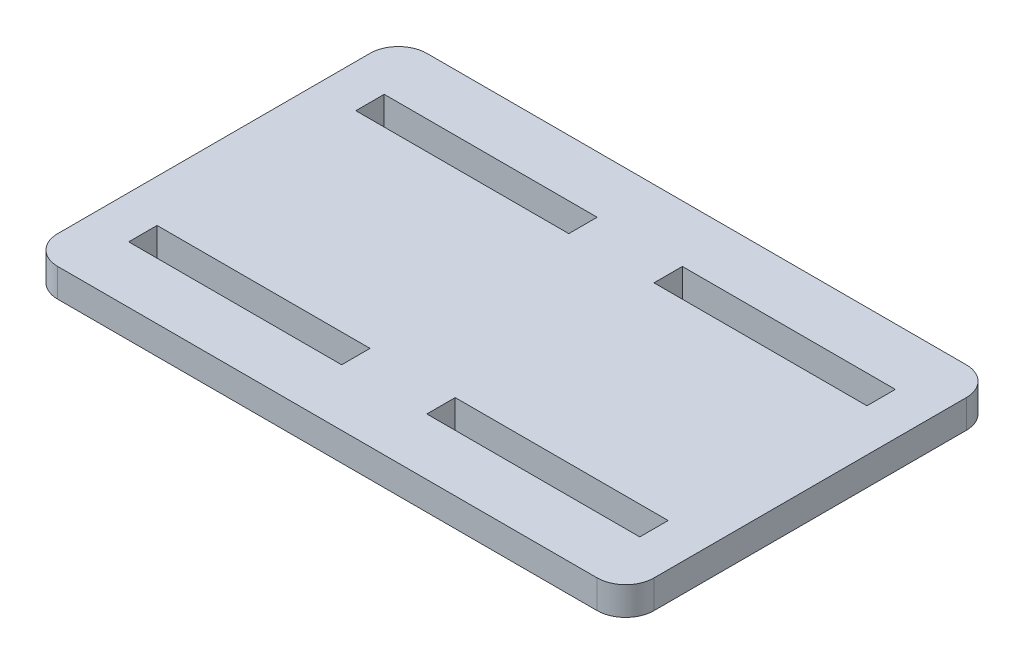
ISO-10303-21;
HEADER;
FILE_DESCRIPTION(('STEP AP214'),'2;1');
FILE_NAME('part.step','',(''),(''),'','','');
FILE_SCHEMA(('AUTOMOTIVE_DESIGN { 1 0 10303 214 1 1 1 1 }'));
ENDSEC;
DATA;
#1=APPLICATION_CONTEXT('core data for automotive mechanical design processes');
#2=APPLICATION_PROTOCOL_DEFINITION('international standard','automotive_design',2000,#1);
#3=PRODUCT_CONTEXT('',#1,'mechanical');
#4=PRODUCT('Part','Part','',(#3));
#5=PRODUCT_RELATED_PRODUCT_CATEGORY('part','',(#4));
#6=PRODUCT_DEFINITION_FORMATION('','',#4);
#7=PRODUCT_DEFINITION_CONTEXT('part definition',#1,'design');
#8=PRODUCT_DEFINITION('design','',#6,#7);
#9=PRODUCT_DEFINITION_SHAPE('','',#8);
#10=(LENGTH_UNIT() NAMED_UNIT(*) SI_UNIT(.MILLI.,.METRE.));
#11=(NAMED_UNIT(*) PLANE_ANGLE_UNIT() SI_UNIT($,.RADIAN.));
#12=(NAMED_UNIT(*) SI_UNIT($,.STERADIAN.) SOLID_ANGLE_UNIT());
#13=UNCERTAINTY_MEASURE_WITH_UNIT(LENGTH_MEASURE(1.E-05),#10,'distance_accuracy_value','');
#14=(GEOMETRIC_REPRESENTATION_CONTEXT(3) GLOBAL_UNCERTAINTY_ASSIGNED_CONTEXT((#13)) GLOBAL_UNIT_ASSIGNED_CONTEXT((#10,
#11,#12)) REPRESENTATION_CONTEXT('',''));
#15=CARTESIAN_POINT('',(0.,0.,0.));
#16=DIRECTION('',(0.,0.,1.));
#17=DIRECTION('',(1.,0.,0.));
#18=AXIS2_PLACEMENT_3D('',#15,#16,#17);
#19=CARTESIAN_POINT('',(-5.07999999999999,-5.08,8.89));
#20=DIRECTION('',(1.,0.,0.));
#21=DIRECTION('',(0.,0.,-1.));
#22=AXIS2_PLACEMENT_3D('',#19,#20,#21);
#23=PLANE('',#22);
#24=DIRECTION('',(0.,0.,-1.));
#25=VECTOR('',#24,1.);
#26=CARTESIAN_POINT('',(-5.07999999999999,-2.54,-8.89));
#27=LINE('',#26,#25);
#28=CARTESIAN_POINT('',(-5.07999999999999,-2.54,8.89));
#29=VERTEX_POINT('',#28);
#30=CARTESIAN_POINT('',(-5.07999999999999,-2.54,-8.89));
#31=VERTEX_POINT('',#30);
#32=EDGE_CURVE('E348',#29,#31,#27,.T.);
#33=ORIENTED_EDGE('',*,*,#32,.F.);
#34=DIRECTION('',(0.,1.,0.));
#35=VECTOR('',#34,1.);
#36=CARTESIAN_POINT('',(-5.07999999999999,-5.08,8.89));
#37=LINE('',#36,#35);
#38=CARTESIAN_POINT('',(-5.07999999999999,0.,8.89));
#39=VERTEX_POINT('',#38);
#40=EDGE_CURVE('E383',#29,#39,#37,.T.);
#41=ORIENTED_EDGE('',*,*,#40,.T.);
#42=DIRECTION('',(0.,0.,-1.));
#43=VECTOR('',#42,1.);
#44=CARTESIAN_POINT('',(-5.07999999999999,0.,8.89));
#45=LINE('',#44,#43);
#46=CARTESIAN_POINT('',(-5.07999999999999,0.,-8.89));
#47=VERTEX_POINT('',#46);
#48=EDGE_CURVE('E372',#39,#47,#45,.T.);
#49=ORIENTED_EDGE('',*,*,#48,.T.);
#50=DIRECTION('',(0.,1.,0.));
#51=VECTOR('',#50,1.);
#52=CARTESIAN_POINT('',(-5.07999999999999,-5.08,-8.89));
#53=LINE('',#52,#51);
#54=EDGE_CURVE('E400',#31,#47,#53,.T.);
#55=ORIENTED_EDGE('',*,*,#54,.F.);
#56=EDGE_LOOP('',(#33,#41,#49,#55));
#57=FACE_BOUND('',#56,.T.);
#58=ADVANCED_FACE('F41',(#57),#23,.F.);
#59=CARTESIAN_POINT('',(11.43,0.,0.));
#60=DIRECTION('',(0.,1.,0.));
#61=DIRECTION('',(0.,0.,1.));
#62=AXIS2_PLACEMENT_3D('',#59,#60,#61);
#63=PLANE('',#62);
#64=DIRECTION('',(1.,0.,0.));
#65=VECTOR('',#64,1.);
#66=CARTESIAN_POINT('',(0.,0.,16.51));
#67=LINE('',#66,#65);
#68=CARTESIAN_POINT('',(-39.37,0.,16.51));
#69=VERTEX_POINT('',#68);
#70=CARTESIAN_POINT('',(8.89,0.,16.51));
#71=VERTEX_POINT('',#70);
#72=EDGE_CURVE('E542',#69,#71,#67,.T.);
#73=ORIENTED_EDGE('',*,*,#72,.F.);
#74=CARTESIAN_POINT('',(-39.37,0.,13.97));
#75=DIRECTION('',(0.,1.,0.));
#76=DIRECTION('',(0.,0.,1.));
#77=AXIS2_PLACEMENT_3D('',#74,#75,#76);
#78=CIRCLE('',#77,2.54);
#79=CARTESIAN_POINT('',(-41.91,0.,13.97));
#80=VERTEX_POINT('',#79);
#81=EDGE_CURVE('E613',#69,#80,#78,.F.);
#82=ORIENTED_EDGE('',*,*,#81,.T.);
#83=DIRECTION('',(0.,0.,-1.));
#84=VECTOR('',#83,1.);
#85=CARTESIAN_POINT('',(-41.91,0.,0.));
#86=LINE('',#85,#84);
#87=CARTESIAN_POINT('',(-41.91,0.,-13.97));
#88=VERTEX_POINT('',#87);
#89=EDGE_CURVE('E559',#80,#88,#86,.T.);
#90=ORIENTED_EDGE('',*,*,#89,.T.);
#91=CARTESIAN_POINT('',(-39.37,0.,-13.97));
#92=DIRECTION('',(0.,1.,0.));
#93=DIRECTION('',(0.,0.,1.));
#94=AXIS2_PLACEMENT_3D('',#91,#92,#93);
#95=CIRCLE('',#94,2.54);
#96=CARTESIAN_POINT('',(-39.37,0.,-16.51));
#97=VERTEX_POINT('',#96);
#98=EDGE_CURVE('E604',#88,#97,#95,.F.);
#99=ORIENTED_EDGE('',*,*,#98,.T.);
#100=DIRECTION('',(1.,0.,0.));
#101=VECTOR('',#100,1.);
#102=CARTESIAN_POINT('',(0.,0.,-16.51));
#103=LINE('',#102,#101);
#104=CARTESIAN_POINT('',(8.89,0.,-16.51));
#105=VERTEX_POINT('',#104);
#106=EDGE_CURVE('E466',#97,#105,#103,.T.);
#107=ORIENTED_EDGE('',*,*,#106,.T.);
#108=CARTESIAN_POINT('',(8.89,0.,-13.97));
#109=DIRECTION('',(0.,1.,0.));
#110=DIRECTION('',(0.,0.,1.));
#111=AXIS2_PLACEMENT_3D('',#108,#109,#110);
#112=CIRCLE('',#111,2.54);
#113=CARTESIAN_POINT('',(11.43,0.,-13.97));
#114=VERTEX_POINT('',#113);
#115=EDGE_CURVE('E607',#105,#114,#112,.F.);
#116=ORIENTED_EDGE('',*,*,#115,.T.);
#117=DIRECTION('',(0.,0.,-1.));
#118=VECTOR('',#117,1.);
#119=CARTESIAN_POINT('',(11.43,0.,0.));
#120=LINE('',#119,#118);
#121=CARTESIAN_POINT('',(11.43,0.,13.97));
#122=VERTEX_POINT('',#121);
#123=EDGE_CURVE('E567',#122,#114,#120,.T.);
#124=ORIENTED_EDGE('',*,*,#123,.F.);
#125=CARTESIAN_POINT('',(8.89,0.,13.97));
#126=DIRECTION('',(0.,1.,0.));
#127=DIRECTION('',(0.,0.,1.));
#128=AXIS2_PLACEMENT_3D('',#125,#126,#127);
#129=CIRCLE('',#128,2.54);
#130=EDGE_CURVE('E610',#122,#71,#129,.F.);
#131=ORIENTED_EDGE('',*,*,#130,.T.);
#132=EDGE_LOOP('',(#73,#82,#90,#99,#107,#116,#124,#131));
#133=FACE_BOUND('',#132,.T.);
#134=DIRECTION('',(-1.,0.,0.));
#135=VECTOR('',#134,1.);
#136=CARTESIAN_POINT('',(11.43,0.,8.89));
#137=LINE('',#136,#135);
#138=CARTESIAN_POINT('',(-19.05,0.,8.89));
#139=VERTEX_POINT('',#138);
#140=CARTESIAN_POINT('',(-25.4,0.,8.89));
#141=VERTEX_POINT('',#140);
#142=EDGE_CURVE('E597',#139,#141,#137,.T.);
#143=ORIENTED_EDGE('',*,*,#142,.T.);
#144=DIRECTION('',(0.,0.,-1.));
#145=VECTOR('',#144,1.);
#146=CARTESIAN_POINT('',(-25.4,0.,8.89));
#147=LINE('',#146,#145);
#148=CARTESIAN_POINT('',(-25.4,0.,-8.89));
#149=VERTEX_POINT('',#148);
#150=EDGE_CURVE('E290',#141,#149,#147,.T.);
#151=ORIENTED_EDGE('',*,*,#150,.T.);
#152=DIRECTION('',(-1.,0.,0.));
#153=VECTOR('',#152,1.);
#154=CARTESIAN_POINT('',(11.43,0.,-8.89));
#155=LINE('',#154,#153);
#156=CARTESIAN_POINT('',(-19.05,0.,-8.89));
#157=VERTEX_POINT('',#156);
#158=EDGE_CURVE('E591',#157,#149,#155,.T.);
#159=ORIENTED_EDGE('',*,*,#158,.F.);
#160=DIRECTION('',(0.,0.,1.));
#161=VECTOR('',#160,1.);
#162=CARTESIAN_POINT('',(-19.05,0.,-16.51));
#163=LINE('',#162,#161);
#164=CARTESIAN_POINT('',(-19.05,0.,-11.43));
#165=VERTEX_POINT('',#164);
#166=EDGE_CURVE('E470',#165,#157,#163,.T.);
#167=ORIENTED_EDGE('',*,*,#166,.F.);
#168=DIRECTION('',(1.,0.,0.));
#169=VECTOR('',#168,1.);
#170=CARTESIAN_POINT('',(-41.912,0.,-11.43));
#171=LINE('',#170,#169);
#172=CARTESIAN_POINT('',(-38.1,0.,-11.43));
#173=VERTEX_POINT('',#172);
#174=EDGE_CURVE('E441',#173,#165,#171,.T.);
#175=ORIENTED_EDGE('',*,*,#174,.F.);
#176=DIRECTION('',(0.,0.,1.));
#177=VECTOR('',#176,1.);
#178=CARTESIAN_POINT('',(-38.1,0.,-16.51));
#179=LINE('',#178,#177);
#180=CARTESIAN_POINT('',(-38.1,0.,-8.89));
#181=VERTEX_POINT('',#180);
#182=EDGE_CURVE('E455',#173,#181,#179,.T.);
#183=ORIENTED_EDGE('',*,*,#182,.T.);
#184=CARTESIAN_POINT('',(-30.48,0.,-8.89));
#185=VERTEX_POINT('',#184);
#186=EDGE_CURVE('E584',#185,#181,#155,.T.);
#187=ORIENTED_EDGE('',*,*,#186,.F.);
#188=DIRECTION('',(0.,0.,1.));
#189=VECTOR('',#188,1.);
#190=CARTESIAN_POINT('',(-30.48,0.,8.89));
#191=LINE('',#190,#189);
#192=CARTESIAN_POINT('',(-30.48,0.,8.89));
#193=VERTEX_POINT('',#192);
#194=EDGE_CURVE('E322',#185,#193,#191,.T.);
#195=ORIENTED_EDGE('',*,*,#194,.T.);
#196=CARTESIAN_POINT('',(-38.1,0.,8.89));
#197=VERTEX_POINT('',#196);
#198=EDGE_CURVE('E589',#193,#197,#137,.T.);
#199=ORIENTED_EDGE('',*,*,#198,.T.);
#200=DIRECTION('',(0.,0.,-1.));
#201=VECTOR('',#200,1.);
#202=CARTESIAN_POINT('',(-38.1,0.,16.51));
#203=LINE('',#202,#201);
#204=CARTESIAN_POINT('',(-38.1,0.,11.43));
#205=VERTEX_POINT('',#204);
#206=EDGE_CURVE('E530',#205,#197,#203,.T.);
#207=ORIENTED_EDGE('',*,*,#206,.F.);
#208=DIRECTION('',(1.,0.,0.));
#209=VECTOR('',#208,1.);
#210=CARTESIAN_POINT('',(-41.912,0.,11.43));
#211=LINE('',#210,#209);
#212=CARTESIAN_POINT('',(-19.05,0.,11.43));
#213=VERTEX_POINT('',#212);
#214=EDGE_CURVE('E518',#205,#213,#211,.T.);
#215=ORIENTED_EDGE('',*,*,#214,.T.);
#216=DIRECTION('',(0.,0.,-1.));
#217=VECTOR('',#216,1.);
#218=CARTESIAN_POINT('',(-19.05,0.,16.51));
#219=LINE('',#218,#217);
#220=EDGE_CURVE('E556',#213,#139,#219,.T.);
#221=ORIENTED_EDGE('',*,*,#220,.T.);
#222=EDGE_LOOP('',(#143,#151,#159,#167,#175,#183,#187,#195,#199,#207,#215,#221));
#223=FACE_BOUND('',#222,.T.);
#224=ORIENTED_EDGE('',*,*,#48,.F.);
#225=CARTESIAN_POINT('',(-11.43,0.,8.89));
#226=VERTEX_POINT('',#225);
#227=EDGE_CURVE('E596',#39,#226,#137,.T.);
#228=ORIENTED_EDGE('',*,*,#227,.T.);
#229=DIRECTION('',(0.,0.,-1.));
#230=VECTOR('',#229,1.);
#231=CARTESIAN_POINT('',(-11.43,0.,16.51));
#232=LINE('',#231,#230);
#233=CARTESIAN_POINT('',(-11.43,0.,11.43));
#234=VERTEX_POINT('',#233);
#235=EDGE_CURVE('E507',#234,#226,#232,.T.);
#236=ORIENTED_EDGE('',*,*,#235,.F.);
#237=DIRECTION('',(-1.,0.,0.));
#238=VECTOR('',#237,1.);
#239=CARTESIAN_POINT('',(11.432,0.,11.43));
#240=LINE('',#239,#238);
#241=CARTESIAN_POINT('',(7.62,0.,11.43));
#242=VERTEX_POINT('',#241);
#243=EDGE_CURVE('E482',#242,#234,#240,.T.);
#244=ORIENTED_EDGE('',*,*,#243,.F.);
#245=DIRECTION('',(0.,0.,-1.));
#246=VECTOR('',#245,1.);
#247=CARTESIAN_POINT('',(7.62,0.,16.51));
#248=LINE('',#247,#246);
#249=CARTESIAN_POINT('',(7.62,0.,8.89));
#250=VERTEX_POINT('',#249);
#251=EDGE_CURVE('E497',#242,#250,#248,.T.);
#252=ORIENTED_EDGE('',*,*,#251,.T.);
#253=CARTESIAN_POINT('',(0.,0.,8.89));
#254=VERTEX_POINT('',#253);
#255=EDGE_CURVE('E592',#250,#254,#137,.T.);
#256=ORIENTED_EDGE('',*,*,#255,.T.);
#257=DIRECTION('',(0.,0.,1.));
#258=VECTOR('',#257,1.);
#259=CARTESIAN_POINT('',(0.,0.,8.89));
#260=LINE('',#259,#258);
#261=CARTESIAN_POINT('',(0.,0.,-8.89));
#262=VERTEX_POINT('',#261);
#263=EDGE_CURVE('E377',#262,#254,#260,.T.);
#264=ORIENTED_EDGE('',*,*,#263,.F.);
#265=CARTESIAN_POINT('',(7.62,0.,-8.89));
#266=VERTEX_POINT('',#265);
#267=EDGE_CURVE('E585',#266,#262,#155,.T.);
#268=ORIENTED_EDGE('',*,*,#267,.F.);
#269=DIRECTION('',(0.,0.,1.));
#270=VECTOR('',#269,1.);
#271=CARTESIAN_POINT('',(7.62,0.,-16.51));
#272=LINE('',#271,#270);
#273=CARTESIAN_POINT('',(7.62,0.,-11.43));
#274=VERTEX_POINT('',#273);
#275=EDGE_CURVE('E422',#274,#266,#272,.T.);
#276=ORIENTED_EDGE('',*,*,#275,.F.);
#277=DIRECTION('',(-1.,0.,0.));
#278=VECTOR('',#277,1.);
#279=CARTESIAN_POINT('',(11.432,0.,-11.43));
#280=LINE('',#279,#278);
#281=CARTESIAN_POINT('',(-11.43,0.,-11.43));
#282=VERTEX_POINT('',#281);
#283=EDGE_CURVE('E412',#274,#282,#280,.T.);
#284=ORIENTED_EDGE('',*,*,#283,.T.);
#285=DIRECTION('',(0.,0.,1.));
#286=VECTOR('',#285,1.);
#287=CARTESIAN_POINT('',(-11.43,0.,-16.51));
#288=LINE('',#287,#286);
#289=CARTESIAN_POINT('',(-11.43,0.,-8.89));
#290=VERTEX_POINT('',#289);
#291=EDGE_CURVE('E434',#282,#290,#288,.T.);
#292=ORIENTED_EDGE('',*,*,#291,.T.);
#293=EDGE_CURVE('E590',#47,#290,#155,.T.);
#294=ORIENTED_EDGE('',*,*,#293,.F.);
#295=EDGE_LOOP('',(#224,#228,#236,#244,#252,#256,#264,#268,#276,#284,#292,#294));
#296=FACE_BOUND('',#295,.T.);
#297=ADVANCED_FACE('F667',(#133,#223,#296),#63,.F.);
#298=CARTESIAN_POINT('',(-11.43,0.,-16.51));
#299=DIRECTION('',(1.,0.,0.));
#300=DIRECTION('',(0.,0.,-1.));
#301=AXIS2_PLACEMENT_3D('',#298,#299,#300);
#302=PLANE('',#301);
#303=ORIENTED_EDGE('',*,*,#291,.F.);
#304=DIRECTION('',(0.,-1.,0.));
#305=VECTOR('',#304,1.);
#306=CARTESIAN_POINT('',(-11.43,0.,-11.43));
#307=LINE('',#306,#305);
#308=CARTESIAN_POINT('',(-11.43,2.54,-11.43));
#309=VERTEX_POINT('',#308);
#310=EDGE_CURVE('E408',#309,#282,#307,.T.);
#311=ORIENTED_EDGE('',*,*,#310,.F.);
#312=DIRECTION('',(0.,0.,1.));
#313=VECTOR('',#312,1.);
#314=CARTESIAN_POINT('',(-11.43,2.54,-16.51));
#315=LINE('',#314,#313);
#316=CARTESIAN_POINT('',(-11.43,2.54,-8.89));
#317=VERTEX_POINT('',#316);
#318=EDGE_CURVE('E431',#309,#317,#315,.T.);
#319=ORIENTED_EDGE('',*,*,#318,.T.);
#320=DIRECTION('',(0.,1.,0.));
#321=VECTOR('',#320,1.);
#322=CARTESIAN_POINT('',(-11.43,0.,-8.89));
#323=LINE('',#322,#321);
#324=EDGE_CURVE('E425',#290,#317,#323,.T.);
#325=ORIENTED_EDGE('',*,*,#324,.F.);
#326=EDGE_LOOP('',(#303,#311,#319,#325));
#327=FACE_BOUND('',#326,.T.);
#328=ADVANCED_FACE('F713',(#327),#302,.T.);
#329=CARTESIAN_POINT('',(7.62,2.54,-16.51));
#330=DIRECTION('',(-1.,0.,0.));
#331=DIRECTION('',(0.,0.,1.));
#332=AXIS2_PLACEMENT_3D('',#329,#330,#331);
#333=PLANE('',#332);
#334=DIRECTION('',(0.,0.,1.));
#335=VECTOR('',#334,1.);
#336=CARTESIAN_POINT('',(7.62,2.54,-16.51));
#337=LINE('',#336,#335);
#338=CARTESIAN_POINT('',(7.62,2.54,-11.43));
#339=VERTEX_POINT('',#338);
#340=CARTESIAN_POINT('',(7.62,2.54,-8.89));
#341=VERTEX_POINT('',#340);
#342=EDGE_CURVE('E421',#339,#341,#337,.T.);
#343=ORIENTED_EDGE('',*,*,#342,.F.);
#344=DIRECTION('',(0.,1.,0.));
#345=VECTOR('',#344,1.);
#346=CARTESIAN_POINT('',(7.62,0.,-11.43));
#347=LINE('',#346,#345);
#348=EDGE_CURVE('E403',#274,#339,#347,.T.);
#349=ORIENTED_EDGE('',*,*,#348,.F.);
#350=ORIENTED_EDGE('',*,*,#275,.T.);
#351=DIRECTION('',(0.,-1.,0.));
#352=VECTOR('',#351,1.);
#353=CARTESIAN_POINT('',(7.62,2.54,-8.89));
#354=LINE('',#353,#352);
#355=EDGE_CURVE('E411',#341,#266,#354,.T.);
#356=ORIENTED_EDGE('',*,*,#355,.F.);
#357=EDGE_LOOP('',(#343,#349,#350,#356));
#358=FACE_BOUND('',#357,.T.);
#359=ADVANCED_FACE('F720',(#358),#333,.T.);
#360=CARTESIAN_POINT('',(11.43,0.,-8.89));
#361=DIRECTION('',(0.,0.,1.));
#362=DIRECTION('',(1.,0.,0.));
#363=AXIS2_PLACEMENT_3D('',#360,#361,#362);
#364=PLANE('',#363);
#365=DIRECTION('',(0.,-1.,0.));
#366=VECTOR('',#365,1.);
#367=CARTESIAN_POINT('',(-38.1,2.54,-8.89));
#368=LINE('',#367,#366);
#369=CARTESIAN_POINT('',(-38.1,2.54,-8.89));
#370=VERTEX_POINT('',#369);
#371=EDGE_CURVE('E446',#370,#181,#368,.T.);
#372=ORIENTED_EDGE('',*,*,#371,.F.);
#373=DIRECTION('',(-1.,0.,0.));
#374=VECTOR('',#373,1.);
#375=CARTESIAN_POINT('',(11.43,2.54,-8.89));
#376=LINE('',#375,#374);
#377=CARTESIAN_POINT('',(-19.05,2.54,-8.89));
#378=VERTEX_POINT('',#377);
#379=EDGE_CURVE('E579',#378,#370,#376,.T.);
#380=ORIENTED_EDGE('',*,*,#379,.F.);
#381=DIRECTION('',(0.,1.,0.));
#382=VECTOR('',#381,1.);
#383=CARTESIAN_POINT('',(-19.05,0.,-8.89));
#384=LINE('',#383,#382);
#385=EDGE_CURVE('E459',#157,#378,#384,.T.);
#386=ORIENTED_EDGE('',*,*,#385,.F.);
#387=ORIENTED_EDGE('',*,*,#158,.T.);
#388=DIRECTION('',(0.,1.,0.));
#389=VECTOR('',#388,1.);
#390=CARTESIAN_POINT('',(-25.4,-5.08,-8.89));
#391=LINE('',#390,#389);
#392=CARTESIAN_POINT('',(-25.4,-2.54,-8.89));
#393=VERTEX_POINT('',#392);
#394=EDGE_CURVE('E285',#393,#149,#391,.T.);
#395=ORIENTED_EDGE('',*,*,#394,.F.);
#396=DIRECTION('',(-1.,0.,0.));
#397=VECTOR('',#396,1.);
#398=CARTESIAN_POINT('',(-20.32,-2.54,-8.89));
#399=LINE('',#398,#397);
#400=CARTESIAN_POINT('',(-20.32,-2.54,-8.89));
#401=VERTEX_POINT('',#400);
#402=EDGE_CURVE('E277',#401,#393,#399,.T.);
#403=ORIENTED_EDGE('',*,*,#402,.F.);
#404=DIRECTION('',(0.,-1.,0.));
#405=VECTOR('',#404,1.);
#406=CARTESIAN_POINT('',(-20.32,-5.08,-8.89));
#407=LINE('',#406,#405);
#408=CARTESIAN_POINT('',(-20.32,-5.08,-8.89));
#409=VERTEX_POINT('',#408);
#410=EDGE_CURVE('E282',#401,#409,#407,.T.);
#411=ORIENTED_EDGE('',*,*,#410,.T.);
#412=DIRECTION('',(-1.,0.,0.));
#413=VECTOR('',#412,1.);
#414=CARTESIAN_POINT('',(-25.4,-5.08,-8.89));
#415=LINE('',#414,#413);
#416=CARTESIAN_POINT('',(-30.48,-5.08,-8.89));
#417=VERTEX_POINT('',#416);
#418=EDGE_CURVE('E326',#409,#417,#415,.T.);
#419=ORIENTED_EDGE('',*,*,#418,.T.);
#420=DIRECTION('',(0.,1.,0.));
#421=VECTOR('',#420,1.);
#422=CARTESIAN_POINT('',(-30.48,-5.08,-8.89));
#423=LINE('',#422,#421);
#424=EDGE_CURVE('E337',#417,#185,#423,.T.);
#425=ORIENTED_EDGE('',*,*,#424,.T.);
#426=ORIENTED_EDGE('',*,*,#186,.T.);
#427=EDGE_LOOP('',(#372,#380,#386,#387,#395,#403,#411,#419,#425,#426));
#428=FACE_BOUND('',#427,.T.);
#429=ADVANCED_FACE('F280',(#428),#364,.F.);
#430=CARTESIAN_POINT('',(11.43,0.,8.89));
#431=DIRECTION('',(0.,0.,1.));
#432=DIRECTION('',(1.,0.,0.));
#433=AXIS2_PLACEMENT_3D('',#430,#431,#432);
#434=PLANE('',#433);
#435=ORIENTED_EDGE('',*,*,#255,.F.);
#436=DIRECTION('',(0.,-1.,0.));
#437=VECTOR('',#436,1.);
#438=CARTESIAN_POINT('',(7.62,2.54,8.89));
#439=LINE('',#438,#437);
#440=CARTESIAN_POINT('',(7.62,2.54,8.89));
#441=VERTEX_POINT('',#440);
#442=EDGE_CURVE('E487',#441,#250,#439,.T.);
#443=ORIENTED_EDGE('',*,*,#442,.F.);
#444=DIRECTION('',(-1.,0.,0.));
#445=VECTOR('',#444,1.);
#446=CARTESIAN_POINT('',(11.43,2.54,8.89));
#447=LINE('',#446,#445);
#448=CARTESIAN_POINT('',(-11.43,2.54,8.89));
#449=VERTEX_POINT('',#448);
#450=EDGE_CURVE('E575',#441,#449,#447,.T.);
#451=ORIENTED_EDGE('',*,*,#450,.T.);
#452=DIRECTION('',(0.,1.,0.));
#453=VECTOR('',#452,1.);
#454=CARTESIAN_POINT('',(-11.43,0.,8.89));
#455=LINE('',#454,#453);
#456=EDGE_CURVE('E501',#226,#449,#455,.T.);
#457=ORIENTED_EDGE('',*,*,#456,.F.);
#458=ORIENTED_EDGE('',*,*,#227,.F.);
#459=ORIENTED_EDGE('',*,*,#40,.F.);
#460=DIRECTION('',(1.,0.,0.));
#461=VECTOR('',#460,1.);
#462=CARTESIAN_POINT('',(-10.16,-2.54,8.89));
#463=LINE('',#462,#461);
#464=CARTESIAN_POINT('',(-10.16,-2.54,8.89));
#465=VERTEX_POINT('',#464);
#466=EDGE_CURVE('E369',#465,#29,#463,.T.);
#467=ORIENTED_EDGE('',*,*,#466,.F.);
#468=DIRECTION('',(0.,1.,0.));
#469=VECTOR('',#468,1.);
#470=CARTESIAN_POINT('',(-10.16,-5.08,8.89));
#471=LINE('',#470,#469);
#472=CARTESIAN_POINT('',(-10.16,-5.08,8.89));
#473=VERTEX_POINT('',#472);
#474=EDGE_CURVE('E357',#473,#465,#471,.T.);
#475=ORIENTED_EDGE('',*,*,#474,.F.);
#476=DIRECTION('',(-1.,0.,0.));
#477=VECTOR('',#476,1.);
#478=CARTESIAN_POINT('',(-5.07999999999999,-5.08,8.89));
#479=LINE('',#478,#477);
#480=CARTESIAN_POINT('',(0.,-5.08,8.89));
#481=VERTEX_POINT('',#480);
#482=EDGE_CURVE('E380',#481,#473,#479,.T.);
#483=ORIENTED_EDGE('',*,*,#482,.F.);
#484=DIRECTION('',(0.,1.,0.));
#485=VECTOR('',#484,1.);
#486=CARTESIAN_POINT('',(0.,-5.08,8.89));
#487=LINE('',#486,#485);
#488=EDGE_CURVE('E392',#481,#254,#487,.T.);
#489=ORIENTED_EDGE('',*,*,#488,.T.);
#490=EDGE_LOOP('',(#435,#443,#451,#457,#458,#459,#467,#475,#483,#489));
#491=FACE_BOUND('',#490,.T.);
#492=ADVANCED_FACE('F751',(#491),#434,.T.);
#493=CARTESIAN_POINT('',(-19.05,0.,16.51));
#494=DIRECTION('',(-1.,0.,0.));
#495=DIRECTION('',(0.,0.,1.));
#496=AXIS2_PLACEMENT_3D('',#493,#494,#495);
#497=PLANE('',#496);
#498=ORIENTED_EDGE('',*,*,#220,.F.);
#499=DIRECTION('',(0.,-1.,0.));
#500=VECTOR('',#499,1.);
#501=CARTESIAN_POINT('',(-19.05,0.,11.43));
#502=LINE('',#501,#500);
#503=CARTESIAN_POINT('',(-19.05,2.54,11.43));
#504=VERTEX_POINT('',#503);
#505=EDGE_CURVE('E514',#504,#213,#502,.T.);
#506=ORIENTED_EDGE('',*,*,#505,.F.);
#507=DIRECTION('',(0.,0.,-1.));
#508=VECTOR('',#507,1.);
#509=CARTESIAN_POINT('',(-19.05,2.54,16.51));
#510=LINE('',#509,#508);
#511=CARTESIAN_POINT('',(-19.05,2.54,8.89));
#512=VERTEX_POINT('',#511);
#513=EDGE_CURVE('E550',#504,#512,#510,.T.);
#514=ORIENTED_EDGE('',*,*,#513,.T.);
#515=DIRECTION('',(0.,1.,0.));
#516=VECTOR('',#515,1.);
#517=CARTESIAN_POINT('',(-19.05,0.,8.89));
#518=LINE('',#517,#516);
#519=EDGE_CURVE('E541',#139,#512,#518,.T.);
#520=ORIENTED_EDGE('',*,*,#519,.F.);
#521=EDGE_LOOP('',(#498,#506,#514,#520));
#522=FACE_BOUND('',#521,.T.);
#523=ADVANCED_FACE('F672',(#522),#497,.T.);
#524=CARTESIAN_POINT('',(-38.1,2.54,16.51));
#525=DIRECTION('',(1.,0.,0.));
#526=DIRECTION('',(0.,0.,-1.));
#527=AXIS2_PLACEMENT_3D('',#524,#525,#526);
#528=PLANE('',#527);
#529=DIRECTION('',(0.,0.,-1.));
#530=VECTOR('',#529,1.);
#531=CARTESIAN_POINT('',(-38.1,2.54,16.51));
#532=LINE('',#531,#530);
#533=CARTESIAN_POINT('',(-38.1,2.54,11.43));
#534=VERTEX_POINT('',#533);
#535=CARTESIAN_POINT('',(-38.1,2.54,8.89));
#536=VERTEX_POINT('',#535);
#537=EDGE_CURVE('E531',#534,#536,#532,.T.);
#538=ORIENTED_EDGE('',*,*,#537,.F.);
#539=DIRECTION('',(0.,1.,0.));
#540=VECTOR('',#539,1.);
#541=CARTESIAN_POINT('',(-38.1,0.,11.43));
#542=LINE('',#541,#540);
#543=EDGE_CURVE('E523',#205,#534,#542,.T.);
#544=ORIENTED_EDGE('',*,*,#543,.F.);
#545=ORIENTED_EDGE('',*,*,#206,.T.);
#546=DIRECTION('',(0.,-1.,0.));
#547=VECTOR('',#546,1.);
#548=CARTESIAN_POINT('',(-38.1,2.54,8.89));
#549=LINE('',#548,#547);
#550=EDGE_CURVE('E534',#536,#197,#549,.T.);
#551=ORIENTED_EDGE('',*,*,#550,.F.);
#552=EDGE_LOOP('',(#538,#544,#545,#551));
#553=FACE_BOUND('',#552,.T.);
#554=ADVANCED_FACE('F663',(#553),#528,.T.);
#555=ORIENTED_EDGE('',*,*,#550,.T.);
#556=ORIENTED_EDGE('',*,*,#198,.F.);
#557=DIRECTION('',(0.,1.,0.));
#558=VECTOR('',#557,1.);
#559=CARTESIAN_POINT('',(-30.48,-5.08,8.89));
#560=LINE('',#559,#558);
#561=CARTESIAN_POINT('',(-30.48,-5.08,8.89));
#562=VERTEX_POINT('',#561);
#563=EDGE_CURVE('E341',#562,#193,#560,.T.);
#564=ORIENTED_EDGE('',*,*,#563,.F.);
#565=DIRECTION('',(1.,0.,0.));
#566=VECTOR('',#565,1.);
#567=CARTESIAN_POINT('',(-25.4,-5.08,8.89));
#568=LINE('',#567,#566);
#569=CARTESIAN_POINT('',(-20.32,-5.08,8.89));
#570=VERTEX_POINT('',#569);
#571=EDGE_CURVE('E318',#562,#570,#568,.T.);
#572=ORIENTED_EDGE('',*,*,#571,.T.);
#573=DIRECTION('',(0.,1.,0.));
#574=VECTOR('',#573,1.);
#575=CARTESIAN_POINT('',(-20.32,-5.08,8.89));
#576=LINE('',#575,#574);
#577=CARTESIAN_POINT('',(-20.32,-2.54,8.89));
#578=VERTEX_POINT('',#577);
#579=EDGE_CURVE('E307',#570,#578,#576,.T.);
#580=ORIENTED_EDGE('',*,*,#579,.T.);
#581=DIRECTION('',(-1.,0.,0.));
#582=VECTOR('',#581,1.);
#583=CARTESIAN_POINT('',(-20.32,-2.54,8.89));
#584=LINE('',#583,#582);
#585=CARTESIAN_POINT('',(-25.4,-2.54,8.89));
#586=VERTEX_POINT('',#585);
#587=EDGE_CURVE('E291',#578,#586,#584,.T.);
#588=ORIENTED_EDGE('',*,*,#587,.T.);
#589=DIRECTION('',(0.,1.,0.));
#590=VECTOR('',#589,1.);
#591=CARTESIAN_POINT('',(-25.4,-5.08,8.89));
#592=LINE('',#591,#590);
#593=EDGE_CURVE('E345',#586,#141,#592,.T.);
#594=ORIENTED_EDGE('',*,*,#593,.T.);
#595=ORIENTED_EDGE('',*,*,#142,.F.);
#596=ORIENTED_EDGE('',*,*,#519,.T.);
#597=EDGE_CURVE('E574',#512,#536,#447,.T.);
#598=ORIENTED_EDGE('',*,*,#597,.T.);
#599=EDGE_LOOP('',(#555,#556,#564,#572,#580,#588,#594,#595,#596,#598));
#600=FACE_BOUND('',#599,.T.);
#601=ADVANCED_FACE('F654',(#600),#434,.T.);
#602=EDGE_CURVE('E580',#341,#317,#376,.T.);
#603=ORIENTED_EDGE('',*,*,#602,.F.);
#604=ORIENTED_EDGE('',*,*,#355,.T.);
#605=ORIENTED_EDGE('',*,*,#267,.T.);
#606=DIRECTION('',(0.,1.,0.));
#607=VECTOR('',#606,1.);
#608=CARTESIAN_POINT('',(0.,-5.08,-8.89));
#609=LINE('',#608,#607);
#610=CARTESIAN_POINT('',(0.,-5.08,-8.89));
#611=VERTEX_POINT('',#610);
#612=EDGE_CURVE('E396',#611,#262,#609,.T.);
#613=ORIENTED_EDGE('',*,*,#612,.F.);
#614=DIRECTION('',(1.,0.,0.));
#615=VECTOR('',#614,1.);
#616=CARTESIAN_POINT('',(-5.07999999999999,-5.08,-8.89));
#617=LINE('',#616,#615);
#618=CARTESIAN_POINT('',(-10.16,-5.08,-8.89));
#619=VERTEX_POINT('',#618);
#620=EDGE_CURVE('E373',#619,#611,#617,.T.);
#621=ORIENTED_EDGE('',*,*,#620,.F.);
#622=DIRECTION('',(0.,-1.,0.));
#623=VECTOR('',#622,1.);
#624=CARTESIAN_POINT('',(-10.16,-5.08,-8.89));
#625=LINE('',#624,#623);
#626=CARTESIAN_POINT('',(-10.16,-2.54,-8.89));
#627=VERTEX_POINT('',#626);
#628=EDGE_CURVE('E349',#627,#619,#625,.T.);
#629=ORIENTED_EDGE('',*,*,#628,.F.);
#630=DIRECTION('',(1.,0.,0.));
#631=VECTOR('',#630,1.);
#632=CARTESIAN_POINT('',(-10.16,-2.54,-8.89));
#633=LINE('',#632,#631);
#634=EDGE_CURVE('E363',#627,#31,#633,.T.);
#635=ORIENTED_EDGE('',*,*,#634,.T.);
#636=ORIENTED_EDGE('',*,*,#54,.T.);
#637=ORIENTED_EDGE('',*,*,#293,.T.);
#638=ORIENTED_EDGE('',*,*,#324,.T.);
#639=EDGE_LOOP('',(#603,#604,#605,#613,#621,#629,#635,#636,#637,#638));
#640=FACE_BOUND('',#639,.T.);
#641=ADVANCED_FACE('F741',(#640),#364,.F.);
#642=CARTESIAN_POINT('',(11.43,2.54,0.));
#643=DIRECTION('',(0.,1.,0.));
#644=DIRECTION('',(0.,0.,1.));
#645=AXIS2_PLACEMENT_3D('',#642,#643,#644);
#646=PLANE('',#645);
#647=ORIENTED_EDGE('',*,*,#318,.F.);
#648=DIRECTION('',(-1.,0.,0.));
#649=VECTOR('',#648,1.);
#650=CARTESIAN_POINT('',(11.432,2.54,-11.43));
#651=LINE('',#650,#649);
#652=EDGE_CURVE('E407',#339,#309,#651,.T.);
#653=ORIENTED_EDGE('',*,*,#652,.F.);
#654=ORIENTED_EDGE('',*,*,#342,.T.);
#655=ORIENTED_EDGE('',*,*,#602,.T.);
#656=EDGE_LOOP('',(#647,#653,#654,#655));
#657=FACE_BOUND('',#656,.T.);
#658=DIRECTION('',(0.,0.,-1.));
#659=VECTOR('',#658,1.);
#660=CARTESIAN_POINT('',(-41.91,2.54,0.));
#661=LINE('',#660,#659);
#662=CARTESIAN_POINT('',(-41.91,2.54,13.97));
#663=VERTEX_POINT('',#662);
#664=CARTESIAN_POINT('',(-41.91,2.54,-13.97));
#665=VERTEX_POINT('',#664);
#666=EDGE_CURVE('E563',#663,#665,#661,.T.);
#667=ORIENTED_EDGE('',*,*,#666,.F.);
#668=CARTESIAN_POINT('',(-39.37,2.54,13.97));
#669=DIRECTION('',(0.,1.,0.));
#670=DIRECTION('',(0.,0.,1.));
#671=AXIS2_PLACEMENT_3D('',#668,#669,#670);
#672=CIRCLE('',#671,2.54);
#673=CARTESIAN_POINT('',(-39.37,2.54,16.51));
#674=VERTEX_POINT('',#673);
#675=EDGE_CURVE('E631',#663,#674,#672,.T.);
#676=ORIENTED_EDGE('',*,*,#675,.T.);
#677=DIRECTION('',(-1.,0.,0.));
#678=VECTOR('',#677,1.);
#679=CARTESIAN_POINT('',(0.,2.54,16.51));
#680=LINE('',#679,#678);
#681=CARTESIAN_POINT('',(8.89,2.54,16.51));
#682=VERTEX_POINT('',#681);
#683=EDGE_CURVE('E546',#682,#674,#680,.T.);
#684=ORIENTED_EDGE('',*,*,#683,.F.);
#685=CARTESIAN_POINT('',(8.89,2.54,13.97));
#686=DIRECTION('',(0.,1.,0.));
#687=DIRECTION('',(0.,0.,1.));
#688=AXIS2_PLACEMENT_3D('',#685,#686,#687);
#689=CIRCLE('',#688,2.54);
#690=CARTESIAN_POINT('',(11.43,2.54,13.97));
#691=VERTEX_POINT('',#690);
#692=EDGE_CURVE('E628',#682,#691,#689,.T.);
#693=ORIENTED_EDGE('',*,*,#692,.T.);
#694=DIRECTION('',(0.,0.,-1.));
#695=VECTOR('',#694,1.);
#696=CARTESIAN_POINT('',(11.43,2.54,0.));
#697=LINE('',#696,#695);
#698=CARTESIAN_POINT('',(11.43,2.54,-13.97));
#699=VERTEX_POINT('',#698);
#700=EDGE_CURVE('E571',#691,#699,#697,.T.);
#701=ORIENTED_EDGE('',*,*,#700,.T.);
#702=CARTESIAN_POINT('',(8.89,2.54,-13.97));
#703=DIRECTION('',(0.,1.,0.));
#704=DIRECTION('',(0.,0.,1.));
#705=AXIS2_PLACEMENT_3D('',#702,#703,#704);
#706=CIRCLE('',#705,2.54);
#707=CARTESIAN_POINT('',(8.89,2.54,-16.51));
#708=VERTEX_POINT('',#707);
#709=EDGE_CURVE('E63',#699,#708,#706,.T.);
#710=ORIENTED_EDGE('',*,*,#709,.T.);
#711=DIRECTION('',(-1.,0.,0.));
#712=VECTOR('',#711,1.);
#713=CARTESIAN_POINT('',(0.,2.54,-16.51));
#714=LINE('',#713,#712);
#715=CARTESIAN_POINT('',(-39.37,2.54,-16.51));
#716=VERTEX_POINT('',#715);
#717=EDGE_CURVE('E463',#708,#716,#714,.T.);
#718=ORIENTED_EDGE('',*,*,#717,.T.);
#719=CARTESIAN_POINT('',(-39.37,2.54,-13.97));
#720=DIRECTION('',(0.,1.,0.));
#721=DIRECTION('',(0.,0.,1.));
#722=AXIS2_PLACEMENT_3D('',#719,#720,#721);
#723=CIRCLE('',#722,2.54);
#724=EDGE_CURVE('E623',#716,#665,#723,.T.);
#725=ORIENTED_EDGE('',*,*,#724,.T.);
#726=EDGE_LOOP('',(#667,#676,#684,#693,#701,#710,#718,#725));
#727=FACE_BOUND('',#726,.T.);
#728=DIRECTION('',(1.,0.,0.));
#729=VECTOR('',#728,1.);
#730=CARTESIAN_POINT('',(-41.912,2.54,-11.43));
#731=LINE('',#730,#729);
#732=CARTESIAN_POINT('',(-38.1,2.54,-11.43));
#733=VERTEX_POINT('',#732);
#734=CARTESIAN_POINT('',(-19.05,2.54,-11.43));
#735=VERTEX_POINT('',#734);
#736=EDGE_CURVE('E447',#733,#735,#731,.T.);
#737=ORIENTED_EDGE('',*,*,#736,.T.);
#738=DIRECTION('',(0.,0.,1.));
#739=VECTOR('',#738,1.);
#740=CARTESIAN_POINT('',(-19.05,2.54,-16.51));
#741=LINE('',#740,#739);
#742=EDGE_CURVE('E476',#735,#378,#741,.T.);
#743=ORIENTED_EDGE('',*,*,#742,.T.);
#744=ORIENTED_EDGE('',*,*,#379,.T.);
#745=DIRECTION('',(0.,0.,1.));
#746=VECTOR('',#745,1.);
#747=CARTESIAN_POINT('',(-38.1,2.54,-16.51));
#748=LINE('',#747,#746);
#749=EDGE_CURVE('E456',#733,#370,#748,.T.);
#750=ORIENTED_EDGE('',*,*,#749,.F.);
#751=EDGE_LOOP('',(#737,#743,#744,#750));
#752=FACE_BOUND('',#751,.T.);
#753=DIRECTION('',(-1.,0.,0.));
#754=VECTOR('',#753,1.);
#755=CARTESIAN_POINT('',(11.432,2.54,11.43));
#756=LINE('',#755,#754);
#757=CARTESIAN_POINT('',(7.62,2.54,11.43));
#758=VERTEX_POINT('',#757);
#759=CARTESIAN_POINT('',(-11.43,2.54,11.43));
#760=VERTEX_POINT('',#759);
#761=EDGE_CURVE('E488',#758,#760,#756,.T.);
#762=ORIENTED_EDGE('',*,*,#761,.T.);
#763=DIRECTION('',(0.,0.,-1.));
#764=VECTOR('',#763,1.);
#765=CARTESIAN_POINT('',(-11.43,2.54,16.51));
#766=LINE('',#765,#764);
#767=EDGE_CURVE('E511',#760,#449,#766,.T.);
#768=ORIENTED_EDGE('',*,*,#767,.T.);
#769=ORIENTED_EDGE('',*,*,#450,.F.);
#770=DIRECTION('',(0.,0.,-1.));
#771=VECTOR('',#770,1.);
#772=CARTESIAN_POINT('',(7.62,2.54,16.51));
#773=LINE('',#772,#771);
#774=EDGE_CURVE('E498',#758,#441,#773,.T.);
#775=ORIENTED_EDGE('',*,*,#774,.F.);
#776=EDGE_LOOP('',(#762,#768,#769,#775));
#777=FACE_BOUND('',#776,.T.);
#778=ORIENTED_EDGE('',*,*,#513,.F.);
#779=DIRECTION('',(1.,0.,0.));
#780=VECTOR('',#779,1.);
#781=CARTESIAN_POINT('',(-41.912,2.54,11.43));
#782=LINE('',#781,#780);
#783=EDGE_CURVE('E519',#534,#504,#782,.T.);
#784=ORIENTED_EDGE('',*,*,#783,.F.);
#785=ORIENTED_EDGE('',*,*,#537,.T.);
#786=ORIENTED_EDGE('',*,*,#597,.F.);
#787=EDGE_LOOP('',(#778,#784,#785,#786));
#788=FACE_BOUND('',#787,.T.);
#789=ADVANCED_FACE('F660',(#657,#727,#752,#777,#788),#646,.T.);
#790=CARTESIAN_POINT('',(11.43,0.,0.));
#791=DIRECTION('',(1.,0.,0.));
#792=DIRECTION('',(0.,0.,-1.));
#793=AXIS2_PLACEMENT_3D('',#790,#791,#792);
#794=PLANE('',#793);
#795=ORIENTED_EDGE('',*,*,#700,.F.);
#796=DIRECTION('',(0.,-1.,0.));
#797=VECTOR('',#796,1.);
#798=CARTESIAN_POINT('',(11.43,0.,13.97));
#799=LINE('',#798,#797);
#800=EDGE_CURVE('E637',#691,#122,#799,.T.);
#801=ORIENTED_EDGE('',*,*,#800,.T.);
#802=ORIENTED_EDGE('',*,*,#123,.T.);
#803=DIRECTION('',(0.,-1.,0.));
#804=VECTOR('',#803,1.);
#805=CARTESIAN_POINT('',(11.43,0.,-13.97));
#806=LINE('',#805,#804);
#807=EDGE_CURVE('E634',#114,#699,#806,.F.);
#808=ORIENTED_EDGE('',*,*,#807,.T.);
#809=EDGE_LOOP('',(#795,#801,#802,#808));
#810=FACE_BOUND('',#809,.T.);
#811=ADVANCED_FACE('F791',(#810),#794,.T.);
#812=CARTESIAN_POINT('',(-41.91,0.,0.));
#813=DIRECTION('',(-1.,0.,0.));
#814=DIRECTION('',(0.,0.,-1.));
#815=AXIS2_PLACEMENT_3D('',#812,#813,#814);
#816=PLANE('',#815);
#817=ORIENTED_EDGE('',*,*,#89,.F.);
#818=DIRECTION('',(0.,-1.,0.));
#819=VECTOR('',#818,1.);
#820=CARTESIAN_POINT('',(-41.91,0.,13.97));
#821=LINE('',#820,#819);
#822=EDGE_CURVE('E620',#80,#663,#821,.F.);
#823=ORIENTED_EDGE('',*,*,#822,.T.);
#824=ORIENTED_EDGE('',*,*,#666,.T.);
#825=DIRECTION('',(0.,-1.,0.));
#826=VECTOR('',#825,1.);
#827=CARTESIAN_POINT('',(-41.91,0.,-13.97));
#828=LINE('',#827,#826);
#829=EDGE_CURVE('E616',#665,#88,#828,.T.);
#830=ORIENTED_EDGE('',*,*,#829,.T.);
#831=EDGE_LOOP('',(#817,#823,#824,#830));
#832=FACE_BOUND('',#831,.T.);
#833=ADVANCED_FACE('F785',(#832),#816,.T.);
#834=CARTESIAN_POINT('',(0.,0.,16.51));
#835=DIRECTION('',(0.,0.,1.));
#836=DIRECTION('',(1.,0.,0.));
#837=AXIS2_PLACEMENT_3D('',#834,#835,#836);
#838=PLANE('',#837);
#839=ORIENTED_EDGE('',*,*,#683,.T.);
#840=DIRECTION('',(0.,-1.,0.));
#841=VECTOR('',#840,1.);
#842=CARTESIAN_POINT('',(-39.37,0.,16.51));
#843=LINE('',#842,#841);
#844=EDGE_CURVE('E600',#674,#69,#843,.T.);
#845=ORIENTED_EDGE('',*,*,#844,.T.);
#846=ORIENTED_EDGE('',*,*,#72,.T.);
#847=DIRECTION('',(0.,-1.,0.));
#848=VECTOR('',#847,1.);
#849=CARTESIAN_POINT('',(8.89,0.,16.51));
#850=LINE('',#849,#848);
#851=EDGE_CURVE('E595',#71,#682,#850,.F.);
#852=ORIENTED_EDGE('',*,*,#851,.T.);
#853=EDGE_LOOP('',(#839,#845,#846,#852));
#854=FACE_BOUND('',#853,.T.);
#855=ADVANCED_FACE('F780',(#854),#838,.T.);
#856=CARTESIAN_POINT('',(-41.912,0.,11.43));
#857=DIRECTION('',(0.,0.,1.));
#858=DIRECTION('',(1.,0.,0.));
#859=AXIS2_PLACEMENT_3D('',#856,#857,#858);
#860=PLANE('',#859);
#861=ORIENTED_EDGE('',*,*,#214,.F.);
#862=ORIENTED_EDGE('',*,*,#543,.T.);
#863=ORIENTED_EDGE('',*,*,#783,.T.);
#864=ORIENTED_EDGE('',*,*,#505,.T.);
#865=EDGE_LOOP('',(#861,#862,#863,#864));
#866=FACE_BOUND('',#865,.T.);
#867=ADVANCED_FACE('F670',(#866),#860,.F.);
#868=CARTESIAN_POINT('',(-11.43,0.,16.51));
#869=DIRECTION('',(-1.,0.,0.));
#870=DIRECTION('',(0.,0.,1.));
#871=AXIS2_PLACEMENT_3D('',#868,#869,#870);
#872=PLANE('',#871);
#873=ORIENTED_EDGE('',*,*,#767,.F.);
#874=DIRECTION('',(0.,-1.,0.));
#875=VECTOR('',#874,1.);
#876=CARTESIAN_POINT('',(-11.43,0.,11.43));
#877=LINE('',#876,#875);
#878=EDGE_CURVE('E483',#760,#234,#877,.T.);
#879=ORIENTED_EDGE('',*,*,#878,.T.);
#880=ORIENTED_EDGE('',*,*,#235,.T.);
#881=ORIENTED_EDGE('',*,*,#456,.T.);
#882=EDGE_LOOP('',(#873,#879,#880,#881));
#883=FACE_BOUND('',#882,.T.);
#884=ADVANCED_FACE('F757',(#883),#872,.F.);
#885=CARTESIAN_POINT('',(7.62,2.54,16.51));
#886=DIRECTION('',(1.,0.,0.));
#887=DIRECTION('',(0.,0.,-1.));
#888=AXIS2_PLACEMENT_3D('',#885,#886,#887);
#889=PLANE('',#888);
#890=ORIENTED_EDGE('',*,*,#251,.F.);
#891=DIRECTION('',(0.,-1.,0.));
#892=VECTOR('',#891,1.);
#893=CARTESIAN_POINT('',(7.62,0.,11.43));
#894=LINE('',#893,#892);
#895=EDGE_CURVE('E479',#758,#242,#894,.T.);
#896=ORIENTED_EDGE('',*,*,#895,.F.);
#897=ORIENTED_EDGE('',*,*,#774,.T.);
#898=ORIENTED_EDGE('',*,*,#442,.T.);
#899=EDGE_LOOP('',(#890,#896,#897,#898));
#900=FACE_BOUND('',#899,.T.);
#901=ADVANCED_FACE('F763',(#900),#889,.F.);
#902=CARTESIAN_POINT('',(11.432,0.,11.43));
#903=DIRECTION('',(0.,0.,-1.));
#904=DIRECTION('',(-1.,0.,0.));
#905=AXIS2_PLACEMENT_3D('',#902,#903,#904);
#906=PLANE('',#905);
#907=ORIENTED_EDGE('',*,*,#761,.F.);
#908=ORIENTED_EDGE('',*,*,#895,.T.);
#909=ORIENTED_EDGE('',*,*,#243,.T.);
#910=ORIENTED_EDGE('',*,*,#878,.F.);
#911=EDGE_LOOP('',(#907,#908,#909,#910));
#912=FACE_BOUND('',#911,.T.);
#913=ADVANCED_FACE('F765',(#912),#906,.T.);
#914=CARTESIAN_POINT('',(-19.05,0.,-16.51));
#915=DIRECTION('',(1.,0.,0.));
#916=DIRECTION('',(0.,0.,-1.));
#917=AXIS2_PLACEMENT_3D('',#914,#915,#916);
#918=PLANE('',#917);
#919=ORIENTED_EDGE('',*,*,#742,.F.);
#920=DIRECTION('',(0.,-1.,0.));
#921=VECTOR('',#920,1.);
#922=CARTESIAN_POINT('',(-19.05,0.,-11.43));
#923=LINE('',#922,#921);
#924=EDGE_CURVE('E442',#735,#165,#923,.T.);
#925=ORIENTED_EDGE('',*,*,#924,.T.);
#926=ORIENTED_EDGE('',*,*,#166,.T.);
#927=ORIENTED_EDGE('',*,*,#385,.T.);
#928=EDGE_LOOP('',(#919,#925,#926,#927));
#929=FACE_BOUND('',#928,.T.);
#930=ADVANCED_FACE('F682',(#929),#918,.F.);
#931=CARTESIAN_POINT('',(0.,0.,-16.51));
#932=DIRECTION('',(0.,0.,-1.));
#933=DIRECTION('',(1.,0.,0.));
#934=AXIS2_PLACEMENT_3D('',#931,#932,#933);
#935=PLANE('',#934);
#936=ORIENTED_EDGE('',*,*,#717,.F.);
#937=DIRECTION('',(0.,-1.,0.));
#938=VECTOR('',#937,1.);
#939=CARTESIAN_POINT('',(8.89,0.,-16.51));
#940=LINE('',#939,#938);
#941=EDGE_CURVE('E11',#708,#105,#940,.T.);
#942=ORIENTED_EDGE('',*,*,#941,.T.);
#943=ORIENTED_EDGE('',*,*,#106,.F.);
#944=DIRECTION('',(0.,-1.,0.));
#945=VECTOR('',#944,1.);
#946=CARTESIAN_POINT('',(-39.37,0.,-16.51));
#947=LINE('',#946,#945);
#948=EDGE_CURVE('E50',#97,#716,#947,.F.);
#949=ORIENTED_EDGE('',*,*,#948,.T.);
#950=EDGE_LOOP('',(#936,#942,#943,#949));
#951=FACE_BOUND('',#950,.T.);
#952=ADVANCED_FACE('F704',(#951),#935,.T.);
#953=CARTESIAN_POINT('',(-38.1,2.54,-16.51));
#954=DIRECTION('',(-1.,0.,0.));
#955=DIRECTION('',(0.,0.,1.));
#956=AXIS2_PLACEMENT_3D('',#953,#954,#955);
#957=PLANE('',#956);
#958=ORIENTED_EDGE('',*,*,#182,.F.);
#959=DIRECTION('',(0.,-1.,0.));
#960=VECTOR('',#959,1.);
#961=CARTESIAN_POINT('',(-38.1,0.,-11.43));
#962=LINE('',#961,#960);
#963=EDGE_CURVE('E438',#733,#173,#962,.T.);
#964=ORIENTED_EDGE('',*,*,#963,.F.);
#965=ORIENTED_EDGE('',*,*,#749,.T.);
#966=ORIENTED_EDGE('',*,*,#371,.T.);
#967=EDGE_LOOP('',(#958,#964,#965,#966));
#968=FACE_BOUND('',#967,.T.);
#969=ADVANCED_FACE('F689',(#968),#957,.F.);
#970=CARTESIAN_POINT('',(-41.912,0.,-11.43));
#971=DIRECTION('',(0.,0.,1.));
#972=DIRECTION('',(1.,0.,0.));
#973=AXIS2_PLACEMENT_3D('',#970,#971,#972);
#974=PLANE('',#973);
#975=ORIENTED_EDGE('',*,*,#736,.F.);
#976=ORIENTED_EDGE('',*,*,#963,.T.);
#977=ORIENTED_EDGE('',*,*,#174,.T.);
#978=ORIENTED_EDGE('',*,*,#924,.F.);
#979=EDGE_LOOP('',(#975,#976,#977,#978));
#980=FACE_BOUND('',#979,.T.);
#981=ADVANCED_FACE('F693',(#980),#974,.T.);
#982=CARTESIAN_POINT('',(11.432,0.,-11.43));
#983=DIRECTION('',(0.,0.,-1.));
#984=DIRECTION('',(-1.,0.,0.));
#985=AXIS2_PLACEMENT_3D('',#982,#983,#984);
#986=PLANE('',#985);
#987=ORIENTED_EDGE('',*,*,#283,.F.);
#988=ORIENTED_EDGE('',*,*,#348,.T.);
#989=ORIENTED_EDGE('',*,*,#652,.T.);
#990=ORIENTED_EDGE('',*,*,#310,.T.);
#991=EDGE_LOOP('',(#987,#988,#989,#990));
#992=FACE_BOUND('',#991,.T.);
#993=ADVANCED_FACE('F695',(#992),#986,.F.);
#994=CARTESIAN_POINT('',(0.,-5.08,8.89));
#995=DIRECTION('',(-1.,0.,0.));
#996=DIRECTION('',(0.,0.,1.));
#997=AXIS2_PLACEMENT_3D('',#994,#995,#996);
#998=PLANE('',#997);
#999=ORIENTED_EDGE('',*,*,#263,.T.);
#1000=ORIENTED_EDGE('',*,*,#488,.F.);
#1001=DIRECTION('',(0.,0.,1.));
#1002=VECTOR('',#1001,1.);
#1003=CARTESIAN_POINT('',(0.,-5.08,8.89));
#1004=LINE('',#1003,#1002);
#1005=EDGE_CURVE('E376',#611,#481,#1004,.T.);
#1006=ORIENTED_EDGE('',*,*,#1005,.F.);
#1007=ORIENTED_EDGE('',*,*,#612,.T.);
#1008=EDGE_LOOP('',(#999,#1000,#1006,#1007));
#1009=FACE_BOUND('',#1008,.T.);
#1010=ADVANCED_FACE('F701',(#1009),#998,.F.);
#1011=CARTESIAN_POINT('',(0.,-5.08,0.));
#1012=DIRECTION('',(0.,-1.,0.));
#1013=DIRECTION('',(0.,0.,-1.));
#1014=AXIS2_PLACEMENT_3D('',#1011,#1012,#1013);
#1015=PLANE('',#1014);
#1016=ORIENTED_EDGE('',*,*,#482,.T.);
#1017=DIRECTION('',(0.,0.,1.));
#1018=VECTOR('',#1017,1.);
#1019=CARTESIAN_POINT('',(-10.16,-5.08,-8.89));
#1020=LINE('',#1019,#1018);
#1021=EDGE_CURVE('E353',#619,#473,#1020,.T.);
#1022=ORIENTED_EDGE('',*,*,#1021,.F.);
#1023=ORIENTED_EDGE('',*,*,#620,.T.);
#1024=ORIENTED_EDGE('',*,*,#1005,.T.);
#1025=EDGE_LOOP('',(#1016,#1022,#1023,#1024));
#1026=FACE_BOUND('',#1025,.T.);
#1027=ADVANCED_FACE('F869',(#1026),#1015,.T.);
#1028=CARTESIAN_POINT('',(-10.16,-2.54,-8.89));
#1029=DIRECTION('',(0.,-1.,0.));
#1030=DIRECTION('',(1.,0.,0.));
#1031=AXIS2_PLACEMENT_3D('',#1028,#1029,#1030);
#1032=PLANE('',#1031);
#1033=ORIENTED_EDGE('',*,*,#32,.T.);
#1034=ORIENTED_EDGE('',*,*,#634,.F.);
#1035=DIRECTION('',(0.,0.,-1.));
#1036=VECTOR('',#1035,1.);
#1037=CARTESIAN_POINT('',(-10.16,-2.54,-8.89));
#1038=LINE('',#1037,#1036);
#1039=EDGE_CURVE('E360',#465,#627,#1038,.T.);
#1040=ORIENTED_EDGE('',*,*,#1039,.F.);
#1041=ORIENTED_EDGE('',*,*,#466,.T.);
#1042=EDGE_LOOP('',(#1033,#1034,#1040,#1041));
#1043=FACE_BOUND('',#1042,.T.);
#1044=ADVANCED_FACE('F900',(#1043),#1032,.F.);
#1045=CARTESIAN_POINT('',(-10.16,0.,0.));
#1046=DIRECTION('',(1.,0.,0.));
#1047=DIRECTION('',(0.,0.,-1.));
#1048=AXIS2_PLACEMENT_3D('',#1045,#1046,#1047);
#1049=PLANE('',#1048);
#1050=ORIENTED_EDGE('',*,*,#628,.T.);
#1051=ORIENTED_EDGE('',*,*,#1021,.T.);
#1052=ORIENTED_EDGE('',*,*,#474,.T.);
#1053=ORIENTED_EDGE('',*,*,#1039,.T.);
#1054=EDGE_LOOP('',(#1050,#1051,#1052,#1053));
#1055=FACE_BOUND('',#1054,.T.);
#1056=ADVANCED_FACE('F909',(#1055),#1049,.F.);
#1057=CARTESIAN_POINT('',(-25.4,-5.08,8.89));
#1058=DIRECTION('',(1.,0.,0.));
#1059=DIRECTION('',(0.,0.,-1.));
#1060=AXIS2_PLACEMENT_3D('',#1057,#1058,#1059);
#1061=PLANE('',#1060);
#1062=DIRECTION('',(0.,0.,-1.));
#1063=VECTOR('',#1062,1.);
#1064=CARTESIAN_POINT('',(-25.4,-2.54,-8.89));
#1065=LINE('',#1064,#1063);
#1066=EDGE_CURVE('E302',#586,#393,#1065,.T.);
#1067=ORIENTED_EDGE('',*,*,#1066,.T.);
#1068=ORIENTED_EDGE('',*,*,#394,.T.);
#1069=ORIENTED_EDGE('',*,*,#150,.F.);
#1070=ORIENTED_EDGE('',*,*,#593,.F.);
#1071=EDGE_LOOP('',(#1067,#1068,#1069,#1070));
#1072=FACE_BOUND('',#1071,.T.);
#1073=ADVANCED_FACE('F675',(#1072),#1061,.T.);
#1074=CARTESIAN_POINT('',(-30.48,-5.08,8.89));
#1075=DIRECTION('',(-1.,0.,0.));
#1076=DIRECTION('',(0.,0.,1.));
#1077=AXIS2_PLACEMENT_3D('',#1074,#1075,#1076);
#1078=PLANE('',#1077);
#1079=ORIENTED_EDGE('',*,*,#194,.F.);
#1080=ORIENTED_EDGE('',*,*,#424,.F.);
#1081=DIRECTION('',(0.,0.,1.));
#1082=VECTOR('',#1081,1.);
#1083=CARTESIAN_POINT('',(-30.48,-5.08,8.89));
#1084=LINE('',#1083,#1082);
#1085=EDGE_CURVE('E321',#417,#562,#1084,.T.);
#1086=ORIENTED_EDGE('',*,*,#1085,.T.);
#1087=ORIENTED_EDGE('',*,*,#563,.T.);
#1088=EDGE_LOOP('',(#1079,#1080,#1086,#1087));
#1089=FACE_BOUND('',#1088,.T.);
#1090=ADVANCED_FACE('F944',(#1089),#1078,.T.);
#1091=CARTESIAN_POINT('',(-30.48,-5.08,0.));
#1092=DIRECTION('',(0.,-1.,0.));
#1093=DIRECTION('',(0.,0.,-1.));
#1094=AXIS2_PLACEMENT_3D('',#1091,#1092,#1093);
#1095=PLANE('',#1094);
#1096=ORIENTED_EDGE('',*,*,#418,.F.);
#1097=DIRECTION('',(0.,0.,1.));
#1098=VECTOR('',#1097,1.);
#1099=CARTESIAN_POINT('',(-20.32,-5.08,-8.89));
#1100=LINE('',#1099,#1098);
#1101=EDGE_CURVE('E300',#409,#570,#1100,.T.);
#1102=ORIENTED_EDGE('',*,*,#1101,.T.);
#1103=ORIENTED_EDGE('',*,*,#571,.F.);
#1104=ORIENTED_EDGE('',*,*,#1085,.F.);
#1105=EDGE_LOOP('',(#1096,#1102,#1103,#1104));
#1106=FACE_BOUND('',#1105,.T.);
#1107=ADVANCED_FACE('F953',(#1106),#1095,.T.);
#1108=CARTESIAN_POINT('',(-20.32,-2.54,-8.89));
#1109=DIRECTION('',(0.,1.,0.));
#1110=DIRECTION('',(-1.,0.,0.));
#1111=AXIS2_PLACEMENT_3D('',#1108,#1109,#1110);
#1112=PLANE('',#1111);
#1113=ORIENTED_EDGE('',*,*,#1066,.F.);
#1114=ORIENTED_EDGE('',*,*,#587,.F.);
#1115=DIRECTION('',(0.,0.,-1.));
#1116=VECTOR('',#1115,1.);
#1117=CARTESIAN_POINT('',(-20.32,-2.54,-8.89));
#1118=LINE('',#1117,#1116);
#1119=EDGE_CURVE('E297',#578,#401,#1118,.T.);
#1120=ORIENTED_EDGE('',*,*,#1119,.T.);
#1121=ORIENTED_EDGE('',*,*,#402,.T.);
#1122=EDGE_LOOP('',(#1113,#1114,#1120,#1121));
#1123=FACE_BOUND('',#1122,.T.);
#1124=ADVANCED_FACE('F304',(#1123),#1112,.T.);
#1125=CARTESIAN_POINT('',(-20.32,0.,0.));
#1126=DIRECTION('',(-1.,0.,0.));
#1127=DIRECTION('',(0.,0.,-1.));
#1128=AXIS2_PLACEMENT_3D('',#1125,#1126,#1127);
#1129=PLANE('',#1128);
#1130=ORIENTED_EDGE('',*,*,#410,.F.);
#1131=ORIENTED_EDGE('',*,*,#1119,.F.);
#1132=ORIENTED_EDGE('',*,*,#579,.F.);
#1133=ORIENTED_EDGE('',*,*,#1101,.F.);
#1134=EDGE_LOOP('',(#1130,#1131,#1132,#1133));
#1135=FACE_BOUND('',#1134,.T.);
#1136=ADVANCED_FACE('F295',(#1135),#1129,.F.);
#1137=CARTESIAN_POINT('',(-39.37,0.,13.97));
#1138=DIRECTION('',(0.,-1.,0.));
#1139=DIRECTION('',(0.,0.,-1.));
#1140=AXIS2_PLACEMENT_3D('',#1137,#1138,#1139);
#1141=CYLINDRICAL_SURFACE('',#1140,2.54);
#1142=ORIENTED_EDGE('',*,*,#675,.F.);
#1143=ORIENTED_EDGE('',*,*,#822,.F.);
#1144=ORIENTED_EDGE('',*,*,#81,.F.);
#1145=ORIENTED_EDGE('',*,*,#844,.F.);
#1146=EDGE_LOOP('',(#1142,#1143,#1144,#1145));
#1147=FACE_BOUND('',#1146,.T.);
#1148=ADVANCED_FACE('F802',(#1147),#1141,.T.);
#1149=CARTESIAN_POINT('',(8.89,0.,13.97));
#1150=DIRECTION('',(0.,-1.,0.));
#1151=DIRECTION('',(0.,0.,-1.));
#1152=AXIS2_PLACEMENT_3D('',#1149,#1150,#1151);
#1153=CYLINDRICAL_SURFACE('',#1152,2.54);
#1154=ORIENTED_EDGE('',*,*,#692,.F.);
#1155=ORIENTED_EDGE('',*,*,#851,.F.);
#1156=ORIENTED_EDGE('',*,*,#130,.F.);
#1157=ORIENTED_EDGE('',*,*,#800,.F.);
#1158=EDGE_LOOP('',(#1154,#1155,#1156,#1157));
#1159=FACE_BOUND('',#1158,.T.);
#1160=ADVANCED_FACE('F805',(#1159),#1153,.T.);
#1161=CARTESIAN_POINT('',(8.89,0.,-13.97));
#1162=DIRECTION('',(0.,-1.,0.));
#1163=DIRECTION('',(0.,0.,-1.));
#1164=AXIS2_PLACEMENT_3D('',#1161,#1162,#1163);
#1165=CYLINDRICAL_SURFACE('',#1164,2.54);
#1166=ORIENTED_EDGE('',*,*,#709,.F.);
#1167=ORIENTED_EDGE('',*,*,#807,.F.);
#1168=ORIENTED_EDGE('',*,*,#115,.F.);
#1169=ORIENTED_EDGE('',*,*,#941,.F.);
#1170=EDGE_LOOP('',(#1166,#1167,#1168,#1169));
#1171=FACE_BOUND('',#1170,.T.);
#1172=ADVANCED_FACE('F808',(#1171),#1165,.T.);
#1173=CARTESIAN_POINT('',(-39.37,0.,-13.97));
#1174=DIRECTION('',(0.,-1.,0.));
#1175=DIRECTION('',(0.,0.,-1.));
#1176=AXIS2_PLACEMENT_3D('',#1173,#1174,#1175);
#1177=CYLINDRICAL_SURFACE('',#1176,2.54);
#1178=ORIENTED_EDGE('',*,*,#724,.F.);
#1179=ORIENTED_EDGE('',*,*,#948,.F.);
#1180=ORIENTED_EDGE('',*,*,#98,.F.);
#1181=ORIENTED_EDGE('',*,*,#829,.F.);
#1182=EDGE_LOOP('',(#1178,#1179,#1180,#1181));
#1183=FACE_BOUND('',#1182,.T.);
#1184=ADVANCED_FACE('F43',(#1183),#1177,.T.);
#1185=CLOSED_SHELL('',(#58,#297,#328,#359,#429,#492,#523,#554,#601,#641,#789,#811,#833,#855,
#867,#884,#901,#913,#930,#952,#969,#981,#993,#1010,#1027,#1044,#1056,#1073,#1090,#1107,#1124,
#1136,#1148,#1160,#1172,#1184));
#1186=MANIFOLD_SOLID_BREP('B2',#1185);
#1187=ADVANCED_BREP_SHAPE_REPRESENTATION('',(#18,#1186),#14);
#1188=SHAPE_DEFINITION_REPRESENTATION(#9,#1187);
ENDSEC;
END-ISO-10303-21;
